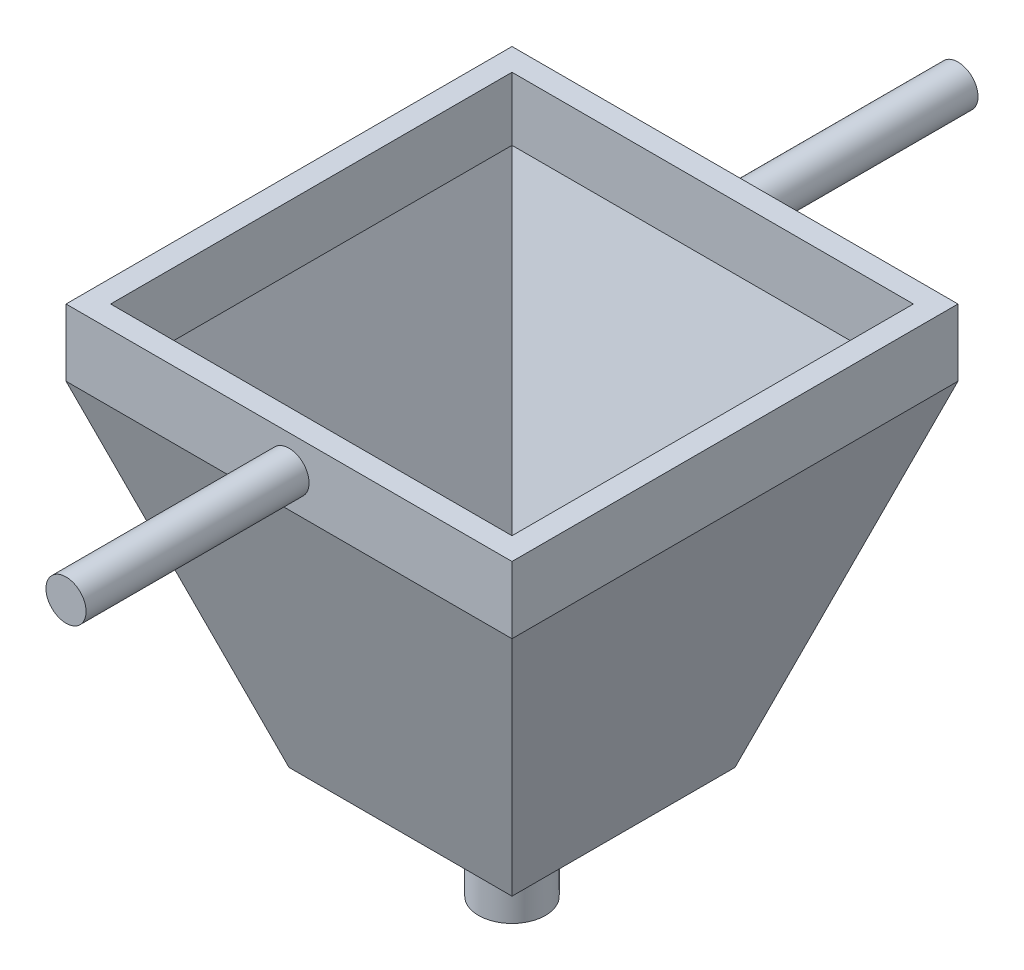
ISO-10303-21;
HEADER;
FILE_DESCRIPTION(('STEP AP214'),'2;1');
FILE_NAME('part.step','',(''),(''),'','','');
FILE_SCHEMA(('AUTOMOTIVE_DESIGN { 1 0 10303 214 1 1 1 1 }'));
ENDSEC;
DATA;
#1=APPLICATION_CONTEXT('core data for automotive mechanical design processes');
#2=APPLICATION_PROTOCOL_DEFINITION('international standard','automotive_design',2000,#1);
#3=PRODUCT_CONTEXT('',#1,'mechanical');
#4=PRODUCT('Part','Part','',(#3));
#5=PRODUCT_RELATED_PRODUCT_CATEGORY('part','',(#4));
#6=PRODUCT_DEFINITION_FORMATION('','',#4);
#7=PRODUCT_DEFINITION_CONTEXT('part definition',#1,'design');
#8=PRODUCT_DEFINITION('design','',#6,#7);
#9=PRODUCT_DEFINITION_SHAPE('','',#8);
#10=(LENGTH_UNIT() NAMED_UNIT(*) SI_UNIT(.MILLI.,.METRE.));
#11=(NAMED_UNIT(*) PLANE_ANGLE_UNIT() SI_UNIT($,.RADIAN.));
#12=(NAMED_UNIT(*) SI_UNIT($,.STERADIAN.) SOLID_ANGLE_UNIT());
#13=UNCERTAINTY_MEASURE_WITH_UNIT(LENGTH_MEASURE(1.E-05),#10,'distance_accuracy_value','');
#14=(GEOMETRIC_REPRESENTATION_CONTEXT(3) GLOBAL_UNCERTAINTY_ASSIGNED_CONTEXT((#13)) GLOBAL_UNIT_ASSIGNED_CONTEXT((#10,
#11,#12)) REPRESENTATION_CONTEXT('',''));
#15=CARTESIAN_POINT('',(0.,0.,0.));
#16=DIRECTION('',(0.,0.,1.));
#17=DIRECTION('',(1.,0.,0.));
#18=AXIS2_PLACEMENT_3D('',#15,#16,#17);
#19=CARTESIAN_POINT('',(0.,16.5,20.));
#20=DIRECTION('',(0.,0.,-1.));
#21=DIRECTION('',(-1.,0.,0.));
#22=AXIS2_PLACEMENT_3D('',#19,#20,#21);
#23=CYLINDRICAL_SURFACE('',#22,0.9);
#24=CARTESIAN_POINT('',(0.,16.5,20.));
#25=DIRECTION('',(0.,0.,1.));
#26=DIRECTION('',(1.,0.,0.));
#27=AXIS2_PLACEMENT_3D('',#24,#25,#26);
#28=CIRCLE('',#27,0.9);
#29=CARTESIAN_POINT('',(0.9,16.5,20.));
#30=VERTEX_POINT('',#29);
#31=EDGE_CURVE('E14',#30,#30,#28,.T.);
#32=ORIENTED_EDGE('',*,*,#31,.F.);
#33=EDGE_LOOP('',(#32));
#34=FACE_BOUND('',#33,.T.);
#35=CARTESIAN_POINT('',(0.,16.5,10.));
#36=DIRECTION('',(0.,0.,1.));
#37=DIRECTION('',(1.,0.,0.));
#38=AXIS2_PLACEMENT_3D('',#35,#36,#37);
#39=CIRCLE('',#38,0.9);
#40=CARTESIAN_POINT('',(0.9,16.5,10.));
#41=VERTEX_POINT('',#40);
#42=EDGE_CURVE('E66',#41,#41,#39,.T.);
#43=ORIENTED_EDGE('',*,*,#42,.T.);
#44=EDGE_LOOP('',(#43));
#45=FACE_BOUND('',#44,.T.);
#46=ADVANCED_FACE('F63',(#34,#45),#23,.T.);
#47=CARTESIAN_POINT('',(0.,16.5,20.));
#48=DIRECTION('',(0.,0.,1.));
#49=DIRECTION('',(1.,0.,0.));
#50=AXIS2_PLACEMENT_3D('',#47,#48,#49);
#51=PLANE('',#50);
#52=ORIENTED_EDGE('',*,*,#31,.T.);
#53=EDGE_LOOP('',(#52));
#54=FACE_BOUND('',#53,.T.);
#55=ADVANCED_FACE('F78',(#54),#51,.T.);
#56=CARTESIAN_POINT('',(0.,16.5,10.));
#57=DIRECTION('',(0.,0.,1.));
#58=DIRECTION('',(1.,0.,0.));
#59=AXIS2_PLACEMENT_3D('',#56,#57,#58);
#60=PLANE('',#59);
#61=ORIENTED_EDGE('',*,*,#42,.F.);
#62=EDGE_LOOP('',(#61));
#63=FACE_BOUND('',#62,.T.);
#64=ADVANCED_FACE('F76',(#63),#60,.F.);
#65=CLOSED_SHELL('',(#46,#55,#64));
#66=MANIFOLD_SOLID_BREP('B2',#65);
#67=CARTESIAN_POINT('',(0.,16.5,-20.));
#68=DIRECTION('',(0.,0.,1.));
#69=DIRECTION('',(1.,0.,0.));
#70=AXIS2_PLACEMENT_3D('',#67,#68,#69);
#71=CYLINDRICAL_SURFACE('',#70,0.900000000000002);
#72=CARTESIAN_POINT('',(0.,16.5,-20.));
#73=DIRECTION('',(0.,0.,-1.));
#74=DIRECTION('',(-1.,0.,0.));
#75=AXIS2_PLACEMENT_3D('',#72,#73,#74);
#76=CIRCLE('',#75,0.900000000000002);
#77=CARTESIAN_POINT('',(-0.900000000000002,16.5,-20.));
#78=VERTEX_POINT('',#77);
#79=EDGE_CURVE('E62',#78,#78,#76,.T.);
#80=ORIENTED_EDGE('',*,*,#79,.F.);
#81=EDGE_LOOP('',(#80));
#82=FACE_BOUND('',#81,.T.);
#83=CARTESIAN_POINT('',(0.,16.5,-10.));
#84=DIRECTION('',(0.,0.,-1.));
#85=DIRECTION('',(-1.,0.,0.));
#86=AXIS2_PLACEMENT_3D('',#83,#84,#85);
#87=CIRCLE('',#86,0.900000000000002);
#88=CARTESIAN_POINT('',(-0.900000000000002,16.5,-10.));
#89=VERTEX_POINT('',#88);
#90=EDGE_CURVE('E118',#89,#89,#87,.T.);
#91=ORIENTED_EDGE('',*,*,#90,.T.);
#92=EDGE_LOOP('',(#91));
#93=FACE_BOUND('',#92,.T.);
#94=ADVANCED_FACE('F115',(#82,#93),#71,.T.);
#95=CARTESIAN_POINT('',(0.,16.5,-20.));
#96=DIRECTION('',(0.,0.,-1.));
#97=DIRECTION('',(-1.,0.,0.));
#98=AXIS2_PLACEMENT_3D('',#95,#96,#97);
#99=PLANE('',#98);
#100=ORIENTED_EDGE('',*,*,#79,.T.);
#101=EDGE_LOOP('',(#100));
#102=FACE_BOUND('',#101,.T.);
#103=ADVANCED_FACE('F130',(#102),#99,.T.);
#104=CARTESIAN_POINT('',(0.,16.5,-10.));
#105=DIRECTION('',(0.,0.,-1.));
#106=DIRECTION('',(-1.,0.,0.));
#107=AXIS2_PLACEMENT_3D('',#104,#105,#106);
#108=PLANE('',#107);
#109=ORIENTED_EDGE('',*,*,#90,.F.);
#110=EDGE_LOOP('',(#109));
#111=FACE_BOUND('',#110,.T.);
#112=ADVANCED_FACE('F128',(#111),#108,.F.);
#113=CLOSED_SHELL('',(#94,#103,#112));
#114=MANIFOLD_SOLID_BREP('B9',#113);
#115=CARTESIAN_POINT('',(0.,-5.,0.));
#116=DIRECTION('',(0.,1.,0.));
#117=DIRECTION('',(0.,0.,1.));
#118=AXIS2_PLACEMENT_3D('',#115,#116,#117);
#119=CYLINDRICAL_SURFACE('',#118,1.5);
#120=CARTESIAN_POINT('',(0.,-5.,0.));
#121=DIRECTION('',(0.,-1.,0.));
#122=DIRECTION('',(0.,0.,-1.));
#123=AXIS2_PLACEMENT_3D('',#120,#121,#122);
#124=CIRCLE('',#123,1.5);
#125=CARTESIAN_POINT('',(0.,-5.,-1.5));
#126=VERTEX_POINT('',#125);
#127=EDGE_CURVE('E113',#126,#126,#124,.T.);
#128=ORIENTED_EDGE('',*,*,#127,.F.);
#129=EDGE_LOOP('',(#128));
#130=FACE_BOUND('',#129,.T.);
#131=CARTESIAN_POINT('',(0.,0.,0.));
#132=DIRECTION('',(0.,-1.,0.));
#133=DIRECTION('',(0.,0.,-1.));
#134=AXIS2_PLACEMENT_3D('',#131,#132,#133);
#135=CIRCLE('',#134,1.5);
#136=CARTESIAN_POINT('',(0.,0.,-1.5));
#137=VERTEX_POINT('',#136);
#138=EDGE_CURVE('E179',#137,#137,#135,.T.);
#139=ORIENTED_EDGE('',*,*,#138,.T.);
#140=EDGE_LOOP('',(#139));
#141=FACE_BOUND('',#140,.T.);
#142=CARTESIAN_POINT('',(1.5,-1.43917780015329,0.));
#143=CARTESIAN_POINT('',(1.50000020822414,-1.43917752533704,0.0502423583340641));
#144=CARTESIAN_POINT('',(1.49745401376693,-1.44298478513104,0.100484543566457));
#145=CARTESIAN_POINT('',(1.48752326211906,-1.45797623220612,0.199366529015834));
#146=CARTESIAN_POINT('',(1.48013640790618,-1.46916392171494,0.248005556977501));
#147=CARTESIAN_POINT('',(1.46125241202354,-1.49823165881571,0.342106153927126));
#148=CARTESIAN_POINT('',(1.44977452746657,-1.51608037015726,0.387581436328778));
#149=CARTESIAN_POINT('',(1.4236306893872,-1.55770948178904,0.474707645498629));
#150=CARTESIAN_POINT('',(1.40896427302755,-1.58149074330357,0.516358015804834));
#151=CARTESIAN_POINT('',(1.37613664684919,-1.636506268837,0.598642350385054));
#152=CARTESIAN_POINT('',(1.3577844878966,-1.66820173052474,0.638890152730338));
#153=CARTESIAN_POINT('',(1.31991156541733,-1.73704282448251,0.713864022346369));
#154=CARTESIAN_POINT('',(1.30038915178416,-1.77419626507216,0.748582027719439));
#155=CARTESIAN_POINT('',(1.25864132339397,-1.85970398395962,0.81711148872748));
#156=CARTESIAN_POINT('',(1.23647533968899,-1.90890062675501,0.849915931813755));
#157=CARTESIAN_POINT('',(1.19542073676408,-2.01335948897656,0.906751785070868));
#158=CARTESIAN_POINT('',(1.17652647977327,-2.06861100093468,0.930798367132495));
#159=CARTESIAN_POINT('',(1.14988133320735,-2.16753344686409,0.963370175057203));
#160=CARTESIAN_POINT('',(1.14048813946218,-2.2099420265902,0.974372236180082));
#161=CARTESIAN_POINT('',(1.12628984829786,-2.29655005252416,0.9907530889261));
#162=CARTESIAN_POINT('',(1.12147684372013,-2.34074627451648,0.996141573259661));
#163=CARTESIAN_POINT('',(1.11718302804083,-2.42991518958136,1.00095682070629));
#164=CARTESIAN_POINT('',(1.11772401279478,-2.47489031187889,1.0003592145882));
#165=CARTESIAN_POINT('',(1.12409887741485,-2.56399528690377,0.993187906666195));
#166=CARTESIAN_POINT('',(1.12993724142592,-2.6081243911696,0.986609141899784));
#167=CARTESIAN_POINT('',(1.14563592995791,-2.69241132577208,0.968324971088712));
#168=CARTESIAN_POINT('',(1.15530744165153,-2.73265846811481,0.956858557405003));
#169=CARTESIAN_POINT('',(1.17754811463845,-2.81068964564904,0.929350592909502));
#170=CARTESIAN_POINT('',(1.19011822916388,-2.84847286530192,0.913307536614355));
#171=CARTESIAN_POINT('',(1.21982098202212,-2.92869049779443,0.873369093698319));
#172=CARTESIAN_POINT('',(1.23736158924507,-2.97050775024735,0.848540261643843));
#173=CARTESIAN_POINT('',(1.27345768922483,-3.04986949764519,0.793344802336529));
#174=CARTESIAN_POINT('',(1.29201441370947,-3.08740862899042,0.762971345040338));
#175=CARTESIAN_POINT('',(1.33271671862096,-3.16544907300885,0.689905826559711));
#176=CARTESIAN_POINT('',(1.35477372355024,-3.20484482450899,0.645969691404499));
#177=CARTESIAN_POINT('',(1.39609050337857,-3.27577604740822,0.55100399955381));
#178=CARTESIAN_POINT('',(1.41535288825285,-3.30731887285433,0.499981149675163));
#179=CARTESIAN_POINT('',(1.44572702044166,-3.35591665946749,0.402428913545601));
#180=CARTESIAN_POINT('',(1.45769630582498,-3.3745994818235,0.356978821685242));
#181=CARTESIAN_POINT('',(1.47753859515521,-3.40523026296523,0.263018021968455));
#182=CARTESIAN_POINT('',(1.48541506063844,-3.4171839137192,0.214509939501018));
#183=CARTESIAN_POINT('',(1.49637941078331,-3.43375838277248,0.115492726585947));
#184=CARTESIAN_POINT('',(1.49944661230576,-3.43834753062247,0.0649759059670237));
#185=CARTESIAN_POINT('',(1.50041557482591,-3.43980134443434,-0.0362207596946167));
#186=CARTESIAN_POINT('',(1.49831769692815,-3.43666655039768,-0.0869005930932817));
#187=CARTESIAN_POINT('',(1.48949794712138,-3.42336577237231,-0.183227858602147));
#188=CARTESIAN_POINT('',(1.48311123195135,-3.41370915127563,-0.228978722339655));
#189=CARTESIAN_POINT('',(1.46659224642396,-3.38837995714691,-0.31805819621364));
#190=CARTESIAN_POINT('',(1.45645937873408,-3.37270642468939,-0.361386418785355));
#191=CARTESIAN_POINT('',(1.4324817626467,-3.33485165163061,-0.447332375233221));
#192=CARTESIAN_POINT('',(1.41844935068245,-3.31233372311153,-0.489748092316564));
#193=CARTESIAN_POINT('',(1.38800927805403,-3.26196115518099,-0.57034151197779));
#194=CARTESIAN_POINT('',(1.37160015200652,-3.23410321989032,-0.608516574097255));
#195=CARTESIAN_POINT('',(1.33477273328243,-3.16887386607092,-0.685927227415323));
#196=CARTESIAN_POINT('',(1.31413078406203,-3.13069467010127,-0.724375937862665));
#197=CARTESIAN_POINT('',(1.27285586536854,-3.04862208518922,-0.794669840332393));
#198=CARTESIAN_POINT('',(1.25222291185946,-3.00472478065389,-0.826510468230433));
#199=CARTESIAN_POINT('',(1.21469839506517,-2.91560659372409,-0.880623882794763));
#200=CARTESIAN_POINT('',(1.19763798588662,-2.87081178325343,-0.903478180804394));
#201=CARTESIAN_POINT('',(1.16719487207113,-2.77724147376272,-0.942481068876251));
#202=CARTESIAN_POINT('',(1.1538055628277,-2.72847333095559,-0.958641728453858));
#203=CARTESIAN_POINT('',(1.13466604076532,-2.63689555658624,-0.981179217293119));
#204=CARTESIAN_POINT('',(1.12797499006895,-2.59459189522382,-0.988792987823092));
#205=CARTESIAN_POINT('',(1.11939733222928,-2.50889115948557,-0.998496029624887));
#206=CARTESIAN_POINT('',(1.11750550674066,-2.46549532458006,-1.00059130142516));
#207=CARTESIAN_POINT('',(1.11882100574833,-2.37885627179493,-0.999119609907757));
#208=CARTESIAN_POINT('',(1.12203134956834,-2.33561315947183,-0.995549293852656));
#209=CARTESIAN_POINT('',(1.1330522619864,-2.25050603588181,-0.982984986109971));
#210=CARTESIAN_POINT('',(1.14086896751217,-2.2086439432229,-0.97398375858765));
#211=CARTESIAN_POINT('',(1.1626342196827,-2.11632220693897,-0.947965178356308));
#212=CARTESIAN_POINT('',(1.17766166854602,-2.06654394378376,-0.929450935941994));
#213=CARTESIAN_POINT('',(1.21111080629161,-1.97143438306388,-0.885422631474874));
#214=CARTESIAN_POINT('',(1.22953724861882,-1.92610945118486,-0.859898741785421));
#215=CARTESIAN_POINT('',(1.26808593269726,-1.83953685655645,-0.801991402694657));
#216=CARTESIAN_POINT('',(1.28823293691071,-1.79837842743403,-0.769491549448272));
#217=CARTESIAN_POINT('',(1.32814150773993,-1.72151656103206,-0.698358840177309));
#218=CARTESIAN_POINT('',(1.3479029541764,-1.68581480164088,-0.659724105134951));
#219=CARTESIAN_POINT('',(1.38815775980392,-1.61582174799623,-0.570728664877768));
#220=CARTESIAN_POINT('',(1.40834902724558,-1.58246848006346,-0.519480834775987));
#221=CARTESIAN_POINT('',(1.44388832937518,-1.5252211618213,-0.410434277887489));
#222=CARTESIAN_POINT('',(1.45924396722731,-1.50131224674147,-0.352646031225022));
#223=CARTESIAN_POINT('',(1.48050822418367,-1.46860051107127,-0.245717534917525));
#224=CARTESIAN_POINT('',(1.48775740184446,-1.45762228060395,-0.197506162628867));
#225=CARTESIAN_POINT('',(1.49750140070948,-1.44291378388427,-0.0995290060120655));
#226=CARTESIAN_POINT('',(1.49999979375663,-1.43917807235529,-0.0497644180940288));
#227=CARTESIAN_POINT('',(1.5,-1.43917780015329,0.));
#228=B_SPLINE_CURVE_WITH_KNOTS('',3,(#142,#143,#144,#145,#146,#147,#148,#149,#150,#151,#152,
#153,#154,#155,#156,#157,#158,#159,#160,#161,#162,#163,#164,#165,#166,#167,#168,#169,#170,#171,
#172,#173,#174,#175,#176,#177,#178,#179,#180,#181,#182,#183,#184,#185,#186,#187,#188,#189,#190,
#191,#192,#193,#194,#195,#196,#197,#198,#199,#200,#201,#202,#203,#204,#205,#206,#207,#208,#209,
#210,#211,#212,#213,#214,#215,#216,#217,#218,#219,#220,#221,#222,#223,#224,#225,#226,#227),
.UNSPECIFIED.,.T.,.F.,(4,2,2,2,2,2,2,2,2,2,2,2,2,2,2,2,2,2,2,2,2,2,2,2,2,2,2,2,2,2,2,2,2,2,2,2,
2,2,2,2,2,2,4),(0.,0.1505266132527,0.301124707174344,0.451023076595116,0.600943219336932,
0.763585145002784,0.926462058021593,1.11503341647991,1.30327652722719,1.43716846838015,
1.57082883922904,1.70503355867689,1.83935198631676,1.96774431099011,2.09617891902539,
2.25073787329797,2.40548851889212,2.5935947724756,2.78152420149865,2.93262043847563,
3.0835886757059,3.23520441646309,3.38680955765891,3.5277654239542,3.66874377568319,
3.81826173413942,3.96787227471786,4.1411408806983,4.31452876587063,4.473249676497,
4.63168313315305,4.76162024003011,4.8914160016149,5.02128860137217,5.15133461921144,
5.31603304346011,5.48096356682587,5.64889622595852,5.81688041978686,6.00897675773024,
6.20076953274023,6.34997645676982,6.49907115623394),.UNSPECIFIED.);
#229=CARTESIAN_POINT('',(1.5,-1.43917780015329,0.));
#230=VERTEX_POINT('',#229);
#231=CARTESIAN_POINT('',(1.5,-3.43917780015329,0.));
#232=VERTEX_POINT('',#231);
#233=EDGE_CURVE('E188',#230,#232,#228,.T.);
#234=ORIENTED_EDGE('',*,*,#233,.F.);
#235=EDGE_CURVE('E186',#232,#230,#228,.T.);
#236=ORIENTED_EDGE('',*,*,#235,.F.);
#237=EDGE_LOOP('',(#234,#236));
#238=FACE_BOUND('',#237,.T.);
#239=ADVANCED_FACE('F170',(#130,#141,#238),#119,.T.);
#240=CARTESIAN_POINT('',(0.,-5.,0.));
#241=DIRECTION('',(0.,-1.,0.));
#242=DIRECTION('',(0.,0.,-1.));
#243=AXIS2_PLACEMENT_3D('',#240,#241,#242);
#244=PLANE('',#243);
#245=CARTESIAN_POINT('',(0.,-5.,0.));
#246=DIRECTION('',(0.,-1.,0.));
#247=DIRECTION('',(0.,0.,-1.));
#248=AXIS2_PLACEMENT_3D('',#245,#246,#247);
#249=CIRCLE('',#248,1.40639171905491);
#250=CARTESIAN_POINT('',(0.,-5.,-1.40639171905491));
#251=VERTEX_POINT('',#250);
#252=EDGE_CURVE('E201',#251,#251,#249,.F.);
#253=ORIENTED_EDGE('',*,*,#252,.T.);
#254=EDGE_LOOP('',(#253));
#255=FACE_BOUND('',#254,.T.);
#256=ORIENTED_EDGE('',*,*,#127,.T.);
#257=EDGE_LOOP('',(#256));
#258=FACE_BOUND('',#257,.T.);
#259=ADVANCED_FACE('F213',(#255,#258),#244,.T.);
#260=CARTESIAN_POINT('',(0.,0.,0.));
#261=DIRECTION('',(0.,-1.,0.));
#262=DIRECTION('',(0.,0.,-1.));
#263=AXIS2_PLACEMENT_3D('',#260,#261,#262);
#264=PLANE('',#263);
#265=CARTESIAN_POINT('',(0.,0.,0.));
#266=DIRECTION('',(0.,-1.,0.));
#267=DIRECTION('',(0.,0.,-1.));
#268=AXIS2_PLACEMENT_3D('',#265,#266,#267);
#269=CIRCLE('',#268,1.40639171905491);
#270=CARTESIAN_POINT('',(0.,0.,-1.40639171905491));
#271=VERTEX_POINT('',#270);
#272=EDGE_CURVE('E174',#271,#271,#269,.F.);
#273=ORIENTED_EDGE('',*,*,#272,.F.);
#274=EDGE_LOOP('',(#273));
#275=FACE_BOUND('',#274,.T.);
#276=ORIENTED_EDGE('',*,*,#138,.F.);
#277=EDGE_LOOP('',(#276));
#278=FACE_BOUND('',#277,.T.);
#279=ADVANCED_FACE('F215',(#275,#278),#264,.F.);
#280=CARTESIAN_POINT('',(1.5,-2.43917780015329,0.));
#281=DIRECTION('',(1.,0.,0.));
#282=DIRECTION('',(0.,0.,-1.));
#283=AXIS2_PLACEMENT_3D('',#280,#281,#282);
#284=PLANE('',#283);
#285=CARTESIAN_POINT('',(1.5,-2.43917780015329,0.));
#286=DIRECTION('',(1.,0.,0.));
#287=DIRECTION('',(0.,0.,-1.));
#288=AXIS2_PLACEMENT_3D('',#285,#286,#287);
#289=CIRCLE('',#288,1.);
#290=EDGE_CURVE('E196',#232,#230,#289,.T.);
#291=ORIENTED_EDGE('',*,*,#290,.T.);
#292=EDGE_CURVE('E198',#230,#232,#289,.T.);
#293=ORIENTED_EDGE('',*,*,#292,.T.);
#294=EDGE_LOOP('',(#291,#293));
#295=FACE_BOUND('',#294,.T.);
#296=ADVANCED_FACE('F200',(#295),#284,.T.);
#297=CARTESIAN_POINT('',(1.5,-2.43917780015329,0.));
#298=DIRECTION('',(-1.,0.,0.));
#299=DIRECTION('',(0.,0.,1.));
#300=AXIS2_PLACEMENT_3D('',#297,#298,#299);
#301=CYLINDRICAL_SURFACE('',#300,1.);
#302=ORIENTED_EDGE('',*,*,#292,.F.);
#303=ORIENTED_EDGE('',*,*,#233,.T.);
#304=EDGE_LOOP('',(#302,#303));
#305=FACE_BOUND('',#304,.T.);
#306=ADVANCED_FACE('F203',(#305),#301,.T.);
#307=ORIENTED_EDGE('',*,*,#290,.F.);
#308=ORIENTED_EDGE('',*,*,#235,.T.);
#309=EDGE_LOOP('',(#307,#308));
#310=FACE_BOUND('',#309,.T.);
#311=ADVANCED_FACE('F195',(#310),#301,.T.);
#312=CARTESIAN_POINT('',(0.,-31.5,0.));
#313=DIRECTION('',(0.,1.,0.));
#314=DIRECTION('',(0.,0.,1.));
#315=AXIS2_PLACEMENT_3D('',#312,#313,#314);
#316=CYLINDRICAL_SURFACE('',#315,1.40639171905491);
#317=ORIENTED_EDGE('',*,*,#252,.F.);
#318=EDGE_LOOP('',(#317));
#319=FACE_BOUND('',#318,.T.);
#320=ORIENTED_EDGE('',*,*,#272,.T.);
#321=EDGE_LOOP('',(#320));
#322=FACE_BOUND('',#321,.T.);
#323=ADVANCED_FACE('F252',(#319,#322),#316,.F.);
#324=CLOSED_SHELL('',(#239,#259,#279,#296,#306,#311,#323));
#325=MANIFOLD_SOLID_BREP('B57',#324);
#326=CARTESIAN_POINT('',(0.,0.,0.));
#327=DIRECTION('',(0.,-1.,0.));
#328=DIRECTION('',(0.,0.,-1.));
#329=AXIS2_PLACEMENT_3D('',#326,#327,#328);
#330=PLANE('',#329);
#331=CARTESIAN_POINT('',(0.,0.,0.));
#332=DIRECTION('',(0.,-1.,0.));
#333=DIRECTION('',(0.,0.,-1.));
#334=AXIS2_PLACEMENT_3D('',#331,#332,#333);
#335=CIRCLE('',#334,1.5);
#336=CARTESIAN_POINT('',(0.,0.,-1.5));
#337=VERTEX_POINT('',#336);
#338=EDGE_CURVE('E754',#337,#337,#335,.T.);
#339=ORIENTED_EDGE('',*,*,#338,.F.);
#340=EDGE_LOOP('',(#339));
#341=FACE_BOUND('',#340,.T.);
#342=DIRECTION('',(0.,0.,-1.));
#343=VECTOR('',#342,1.);
#344=CARTESIAN_POINT('',(5.,0.,5.));
#345=LINE('',#344,#343);
#346=CARTESIAN_POINT('',(5.,0.,5.));
#347=VERTEX_POINT('',#346);
#348=CARTESIAN_POINT('',(5.,0.,-5.));
#349=VERTEX_POINT('',#348);
#350=EDGE_CURVE('E510',#347,#349,#345,.T.);
#351=ORIENTED_EDGE('',*,*,#350,.F.);
#352=DIRECTION('',(1.,0.,0.));
#353=VECTOR('',#352,1.);
#354=CARTESIAN_POINT('',(-5.,0.,5.));
#355=LINE('',#354,#353);
#356=CARTESIAN_POINT('',(-5.,0.,5.));
#357=VERTEX_POINT('',#356);
#358=EDGE_CURVE('E168',#357,#347,#355,.T.);
#359=ORIENTED_EDGE('',*,*,#358,.F.);
#360=DIRECTION('',(0.,0.,1.));
#361=VECTOR('',#360,1.);
#362=CARTESIAN_POINT('',(-5.,0.,5.));
#363=LINE('',#362,#361);
#364=CARTESIAN_POINT('',(-5.,0.,-5.));
#365=VERTEX_POINT('',#364);
#366=EDGE_CURVE('E290',#365,#357,#363,.T.);
#367=ORIENTED_EDGE('',*,*,#366,.F.);
#368=DIRECTION('',(-1.,0.,0.));
#369=VECTOR('',#368,1.);
#370=CARTESIAN_POINT('',(-5.,0.,-5.));
#371=LINE('',#370,#369);
#372=EDGE_CURVE('E498',#349,#365,#371,.T.);
#373=ORIENTED_EDGE('',*,*,#372,.F.);
#374=EDGE_LOOP('',(#351,#359,#367,#373));
#375=FACE_BOUND('',#374,.T.);
#376=ADVANCED_FACE('F281',(#341,#375),#330,.T.);
#377=CARTESIAN_POINT('',(-4.5,-1.5,0.));
#378=DIRECTION('',(-0.948683298050514,-0.316227766016838,0.));
#379=DIRECTION('',(0.316227766016838,-0.948683298050514,0.));
#380=AXIS2_PLACEMENT_3D('',#377,#378,#379);
#381=PLANE('',#380);
#382=DIRECTION('',(0.301511344577764,-0.904534033733291,0.301511344577763));
#383=VECTOR('',#382,1.);
#384=CARTESIAN_POINT('',(-10.,15.,-10.));
#385=LINE('',#384,#383);
#386=CARTESIAN_POINT('',(-10.,15.,-10.));
#387=VERTEX_POINT('',#386);
#388=EDGE_CURVE('E554',#387,#365,#385,.T.);
#389=ORIENTED_EDGE('',*,*,#388,.T.);
#390=ORIENTED_EDGE('',*,*,#366,.T.);
#391=DIRECTION('',(0.301511344577764,-0.904534033733291,-0.301511344577764));
#392=VECTOR('',#391,1.);
#393=CARTESIAN_POINT('',(-10.,15.,10.));
#394=LINE('',#393,#392);
#395=CARTESIAN_POINT('',(-10.,15.,10.));
#396=VERTEX_POINT('',#395);
#397=EDGE_CURVE('E452',#396,#357,#394,.T.);
#398=ORIENTED_EDGE('',*,*,#397,.F.);
#399=DIRECTION('',(0.,0.,1.));
#400=VECTOR('',#399,1.);
#401=CARTESIAN_POINT('',(-10.,15.,10.));
#402=LINE('',#401,#400);
#403=EDGE_CURVE('E566',#387,#396,#402,.T.);
#404=ORIENTED_EDGE('',*,*,#403,.F.);
#405=EDGE_LOOP('',(#389,#390,#398,#404));
#406=FACE_BOUND('',#405,.T.);
#407=ADVANCED_FACE('F465',(#406),#381,.T.);
#408=CARTESIAN_POINT('',(0.,-1.5,4.5));
#409=DIRECTION('',(0.,-0.316227766016838,0.948683298050514));
#410=DIRECTION('',(0.,-0.948683298050514,-0.316227766016838));
#411=AXIS2_PLACEMENT_3D('',#408,#409,#410);
#412=PLANE('',#411);
#413=ORIENTED_EDGE('',*,*,#397,.T.);
#414=ORIENTED_EDGE('',*,*,#358,.T.);
#415=DIRECTION('',(-0.301511344577763,-0.904534033733291,-0.301511344577764));
#416=VECTOR('',#415,1.);
#417=CARTESIAN_POINT('',(10.,15.,10.));
#418=LINE('',#417,#416);
#419=CARTESIAN_POINT('',(10.,15.,10.));
#420=VERTEX_POINT('',#419);
#421=EDGE_CURVE('E306',#420,#347,#418,.T.);
#422=ORIENTED_EDGE('',*,*,#421,.F.);
#423=DIRECTION('',(1.,0.,0.));
#424=VECTOR('',#423,1.);
#425=CARTESIAN_POINT('',(-10.,15.,10.));
#426=LINE('',#425,#424);
#427=EDGE_CURVE('E446',#396,#420,#426,.T.);
#428=ORIENTED_EDGE('',*,*,#427,.F.);
#429=EDGE_LOOP('',(#413,#414,#422,#428));
#430=FACE_BOUND('',#429,.T.);
#431=ADVANCED_FACE('F454',(#430),#412,.T.);
#432=CARTESIAN_POINT('',(0.,-1.5,-4.5));
#433=DIRECTION('',(0.,-0.316227766016838,-0.948683298050514));
#434=DIRECTION('',(0.,0.948683298050514,-0.316227766016838));
#435=AXIS2_PLACEMENT_3D('',#432,#433,#434);
#436=PLANE('',#435);
#437=DIRECTION('',(-0.301511344577763,-0.904534033733291,0.301511344577764));
#438=VECTOR('',#437,1.);
#439=CARTESIAN_POINT('',(10.,15.,-10.));
#440=LINE('',#439,#438);
#441=CARTESIAN_POINT('',(10.,15.,-10.));
#442=VERTEX_POINT('',#441);
#443=EDGE_CURVE('E539',#442,#349,#440,.T.);
#444=ORIENTED_EDGE('',*,*,#443,.T.);
#445=ORIENTED_EDGE('',*,*,#372,.T.);
#446=ORIENTED_EDGE('',*,*,#388,.F.);
#447=DIRECTION('',(-1.,0.,0.));
#448=VECTOR('',#447,1.);
#449=CARTESIAN_POINT('',(-10.,15.,-10.));
#450=LINE('',#449,#448);
#451=EDGE_CURVE('E551',#442,#387,#450,.T.);
#452=ORIENTED_EDGE('',*,*,#451,.F.);
#453=EDGE_LOOP('',(#444,#445,#446,#452));
#454=FACE_BOUND('',#453,.T.);
#455=ADVANCED_FACE('F464',(#454),#436,.T.);
#456=CARTESIAN_POINT('',(4.5,-1.5,0.));
#457=DIRECTION('',(0.948683298050514,-0.316227766016838,0.));
#458=DIRECTION('',(0.316227766016838,0.948683298050514,0.));
#459=AXIS2_PLACEMENT_3D('',#456,#457,#458);
#460=PLANE('',#459);
#461=ORIENTED_EDGE('',*,*,#421,.T.);
#462=ORIENTED_EDGE('',*,*,#350,.T.);
#463=ORIENTED_EDGE('',*,*,#443,.F.);
#464=DIRECTION('',(0.,0.,-1.));
#465=VECTOR('',#464,1.);
#466=CARTESIAN_POINT('',(10.,15.,10.));
#467=LINE('',#466,#465);
#468=EDGE_CURVE('E536',#420,#442,#467,.T.);
#469=ORIENTED_EDGE('',*,*,#468,.F.);
#470=EDGE_LOOP('',(#461,#462,#463,#469));
#471=FACE_BOUND('',#470,.T.);
#472=ADVANCED_FACE('F516',(#471),#460,.T.);
#473=CARTESIAN_POINT('',(-10.,18.,10.));
#474=DIRECTION('',(1.,0.,0.));
#475=DIRECTION('',(0.,0.,-1.));
#476=AXIS2_PLACEMENT_3D('',#473,#474,#475);
#477=PLANE('',#476);
#478=ORIENTED_EDGE('',*,*,#403,.T.);
#479=DIRECTION('',(0.,-1.,0.));
#480=VECTOR('',#479,1.);
#481=CARTESIAN_POINT('',(-10.,18.,10.));
#482=LINE('',#481,#480);
#483=CARTESIAN_POINT('',(-10.,18.,10.));
#484=VERTEX_POINT('',#483);
#485=EDGE_CURVE('E616',#484,#396,#482,.T.);
#486=ORIENTED_EDGE('',*,*,#485,.F.);
#487=DIRECTION('',(0.,0.,1.));
#488=VECTOR('',#487,1.);
#489=CARTESIAN_POINT('',(-10.,18.,10.));
#490=LINE('',#489,#488);
#491=CARTESIAN_POINT('',(-10.,18.,-10.));
#492=VERTEX_POINT('',#491);
#493=EDGE_CURVE('E382',#492,#484,#490,.T.);
#494=ORIENTED_EDGE('',*,*,#493,.F.);
#495=DIRECTION('',(0.,-1.,0.));
#496=VECTOR('',#495,1.);
#497=CARTESIAN_POINT('',(-10.,18.,-10.));
#498=LINE('',#497,#496);
#499=EDGE_CURVE('E440',#492,#387,#498,.T.);
#500=ORIENTED_EDGE('',*,*,#499,.T.);
#501=EDGE_LOOP('',(#478,#486,#494,#500));
#502=FACE_BOUND('',#501,.T.);
#503=ADVANCED_FACE('F524',(#502),#477,.F.);
#504=CARTESIAN_POINT('',(10.,18.,10.));
#505=DIRECTION('',(0.,0.,-1.));
#506=DIRECTION('',(-1.,0.,0.));
#507=AXIS2_PLACEMENT_3D('',#504,#505,#506);
#508=PLANE('',#507);
#509=CARTESIAN_POINT('',(0.,16.5,10.));
#510=DIRECTION('',(0.,0.,1.));
#511=DIRECTION('',(1.,0.,0.));
#512=AXIS2_PLACEMENT_3D('',#509,#510,#511);
#513=CIRCLE('',#512,0.9);
#514=CARTESIAN_POINT('',(0.9,16.5,10.));
#515=VERTEX_POINT('',#514);
#516=EDGE_CURVE('E939',#515,#515,#513,.T.);
#517=ORIENTED_EDGE('',*,*,#516,.F.);
#518=EDGE_LOOP('',(#517));
#519=FACE_BOUND('',#518,.T.);
#520=ORIENTED_EDGE('',*,*,#427,.T.);
#521=DIRECTION('',(0.,-1.,0.));
#522=VECTOR('',#521,1.);
#523=CARTESIAN_POINT('',(10.,18.,10.));
#524=LINE('',#523,#522);
#525=CARTESIAN_POINT('',(10.,18.,10.));
#526=VERTEX_POINT('',#525);
#527=EDGE_CURVE('E608',#526,#420,#524,.T.);
#528=ORIENTED_EDGE('',*,*,#527,.F.);
#529=DIRECTION('',(1.,0.,0.));
#530=VECTOR('',#529,1.);
#531=CARTESIAN_POINT('',(10.,18.,10.));
#532=LINE('',#531,#530);
#533=EDGE_CURVE('E434',#484,#526,#532,.T.);
#534=ORIENTED_EDGE('',*,*,#533,.F.);
#535=ORIENTED_EDGE('',*,*,#485,.T.);
#536=EDGE_LOOP('',(#520,#528,#534,#535));
#537=FACE_BOUND('',#536,.T.);
#538=ADVANCED_FACE('F628',(#519,#537),#508,.F.);
#539=CARTESIAN_POINT('',(10.,18.,10.));
#540=DIRECTION('',(-1.,0.,0.));
#541=DIRECTION('',(0.,0.,1.));
#542=AXIS2_PLACEMENT_3D('',#539,#540,#541);
#543=PLANE('',#542);
#544=ORIENTED_EDGE('',*,*,#468,.T.);
#545=DIRECTION('',(0.,-1.,0.));
#546=VECTOR('',#545,1.);
#547=CARTESIAN_POINT('',(10.,18.,-10.));
#548=LINE('',#547,#546);
#549=CARTESIAN_POINT('',(10.,18.,-10.));
#550=VERTEX_POINT('',#549);
#551=EDGE_CURVE('E617',#550,#442,#548,.T.);
#552=ORIENTED_EDGE('',*,*,#551,.F.);
#553=DIRECTION('',(0.,0.,-1.));
#554=VECTOR('',#553,1.);
#555=CARTESIAN_POINT('',(10.,18.,10.));
#556=LINE('',#555,#554);
#557=EDGE_CURVE('E436',#526,#550,#556,.T.);
#558=ORIENTED_EDGE('',*,*,#557,.F.);
#559=ORIENTED_EDGE('',*,*,#527,.T.);
#560=EDGE_LOOP('',(#544,#552,#558,#559));
#561=FACE_BOUND('',#560,.T.);
#562=ADVANCED_FACE('F637',(#561),#543,.F.);
#563=CARTESIAN_POINT('',(10.,18.,-10.));
#564=DIRECTION('',(0.,0.,1.));
#565=DIRECTION('',(1.,0.,0.));
#566=AXIS2_PLACEMENT_3D('',#563,#564,#565);
#567=PLANE('',#566);
#568=CARTESIAN_POINT('',(0.,16.5,-10.));
#569=DIRECTION('',(0.,0.,-1.));
#570=DIRECTION('',(-1.,0.,0.));
#571=AXIS2_PLACEMENT_3D('',#568,#569,#570);
#572=CIRCLE('',#571,0.9);
#573=CARTESIAN_POINT('',(-0.9,16.5,-10.));
#574=VERTEX_POINT('',#573);
#575=EDGE_CURVE('E759',#574,#574,#572,.T.);
#576=ORIENTED_EDGE('',*,*,#575,.F.);
#577=EDGE_LOOP('',(#576));
#578=FACE_BOUND('',#577,.T.);
#579=ORIENTED_EDGE('',*,*,#451,.T.);
#580=ORIENTED_EDGE('',*,*,#499,.F.);
#581=DIRECTION('',(-1.,0.,0.));
#582=VECTOR('',#581,1.);
#583=CARTESIAN_POINT('',(10.,18.,-10.));
#584=LINE('',#583,#582);
#585=EDGE_CURVE('E438',#550,#492,#584,.T.);
#586=ORIENTED_EDGE('',*,*,#585,.F.);
#587=ORIENTED_EDGE('',*,*,#551,.T.);
#588=EDGE_LOOP('',(#579,#580,#586,#587));
#589=FACE_BOUND('',#588,.T.);
#590=ADVANCED_FACE('F681',(#578,#589),#567,.F.);
#591=CARTESIAN_POINT('',(0.,18.,0.));
#592=DIRECTION('',(0.,1.,0.));
#593=DIRECTION('',(0.,0.,1.));
#594=AXIS2_PLACEMENT_3D('',#591,#592,#593);
#595=PLANE('',#594);
#596=DIRECTION('',(0.,0.,1.));
#597=VECTOR('',#596,1.);
#598=CARTESIAN_POINT('',(-9.,18.,10.));
#599=LINE('',#598,#597);
#600=CARTESIAN_POINT('',(-9.,18.,-9.));
#601=VERTEX_POINT('',#600);
#602=CARTESIAN_POINT('',(-9.,18.,9.));
#603=VERTEX_POINT('',#602);
#604=EDGE_CURVE('E425',#601,#603,#599,.T.);
#605=ORIENTED_EDGE('',*,*,#604,.F.);
#606=DIRECTION('',(-1.,0.,0.));
#607=VECTOR('',#606,1.);
#608=CARTESIAN_POINT('',(10.,18.,-9.));
#609=LINE('',#608,#607);
#610=CARTESIAN_POINT('',(9.,18.,-9.));
#611=VERTEX_POINT('',#610);
#612=EDGE_CURVE('E421',#611,#601,#609,.T.);
#613=ORIENTED_EDGE('',*,*,#612,.F.);
#614=DIRECTION('',(0.,0.,-1.));
#615=VECTOR('',#614,1.);
#616=CARTESIAN_POINT('',(9.,18.,10.));
#617=LINE('',#616,#615);
#618=CARTESIAN_POINT('',(9.,18.,9.));
#619=VERTEX_POINT('',#618);
#620=EDGE_CURVE('E429',#619,#611,#617,.T.);
#621=ORIENTED_EDGE('',*,*,#620,.F.);
#622=DIRECTION('',(1.,0.,0.));
#623=VECTOR('',#622,1.);
#624=CARTESIAN_POINT('',(10.,18.,9.));
#625=LINE('',#624,#623);
#626=EDGE_CURVE('E427',#603,#619,#625,.T.);
#627=ORIENTED_EDGE('',*,*,#626,.F.);
#628=EDGE_LOOP('',(#605,#613,#621,#627));
#629=FACE_BOUND('',#628,.T.);
#630=ORIENTED_EDGE('',*,*,#493,.T.);
#631=ORIENTED_EDGE('',*,*,#533,.T.);
#632=ORIENTED_EDGE('',*,*,#557,.T.);
#633=ORIENTED_EDGE('',*,*,#585,.T.);
#634=EDGE_LOOP('',(#630,#631,#632,#633));
#635=FACE_BOUND('',#634,.T.);
#636=ADVANCED_FACE('F690',(#629,#635),#595,.T.);
#637=CARTESIAN_POINT('',(0.,1.,0.));
#638=DIRECTION('',(0.,-1.,0.));
#639=DIRECTION('',(0.,0.,-1.));
#640=AXIS2_PLACEMENT_3D('',#637,#638,#639);
#641=PLANE('',#640);
#642=CARTESIAN_POINT('',(0.,1.,0.));
#643=DIRECTION('',(0.,-1.,0.));
#644=DIRECTION('',(0.,0.,-1.));
#645=AXIS2_PLACEMENT_3D('',#642,#643,#644);
#646=CIRCLE('',#645,1.5);
#647=CARTESIAN_POINT('',(0.,1.,-1.5));
#648=VERTEX_POINT('',#647);
#649=EDGE_CURVE('E285',#648,#648,#646,.T.);
#650=ORIENTED_EDGE('',*,*,#649,.T.);
#651=EDGE_LOOP('',(#650));
#652=FACE_BOUND('',#651,.T.);
#653=DIRECTION('',(0.,0.,-1.));
#654=VECTOR('',#653,1.);
#655=CARTESIAN_POINT('',(4.27924077994388,1.,0.));
#656=LINE('',#655,#654);
#657=CARTESIAN_POINT('',(4.27924077994388,1.,4.27924077994387));
#658=VERTEX_POINT('',#657);
#659=CARTESIAN_POINT('',(4.27924077994388,1.,-4.27924077994387));
#660=VERTEX_POINT('',#659);
#661=EDGE_CURVE('E407',#658,#660,#656,.T.);
#662=ORIENTED_EDGE('',*,*,#661,.T.);
#663=DIRECTION('',(-1.,0.,0.));
#664=VECTOR('',#663,1.);
#665=CARTESIAN_POINT('',(0.,1.,-4.27924077994387));
#666=LINE('',#665,#664);
#667=CARTESIAN_POINT('',(-4.27924077994387,1.,-4.27924077994387));
#668=VERTEX_POINT('',#667);
#669=EDGE_CURVE('E387',#660,#668,#666,.T.);
#670=ORIENTED_EDGE('',*,*,#669,.T.);
#671=DIRECTION('',(0.,0.,1.));
#672=VECTOR('',#671,1.);
#673=CARTESIAN_POINT('',(-4.27924077994387,1.,0.));
#674=LINE('',#673,#672);
#675=CARTESIAN_POINT('',(-4.27924077994387,1.,4.27924077994387));
#676=VERTEX_POINT('',#675);
#677=EDGE_CURVE('E383',#668,#676,#674,.T.);
#678=ORIENTED_EDGE('',*,*,#677,.T.);
#679=DIRECTION('',(1.,0.,0.));
#680=VECTOR('',#679,1.);
#681=CARTESIAN_POINT('',(0.,1.,4.27924077994387));
#682=LINE('',#681,#680);
#683=EDGE_CURVE('E371',#676,#658,#682,.T.);
#684=ORIENTED_EDGE('',*,*,#683,.T.);
#685=EDGE_LOOP('',(#662,#670,#678,#684));
#686=FACE_BOUND('',#685,.T.);
#687=ADVANCED_FACE('F386',(#652,#686),#641,.F.);
#688=CARTESIAN_POINT('',(-3.55131670194948,-1.18377223398316,0.));
#689=DIRECTION('',(-0.948683298050514,-0.316227766016838,0.));
#690=DIRECTION('',(0.316227766016838,-0.948683298050514,0.));
#691=AXIS2_PLACEMENT_3D('',#688,#689,#690);
#692=PLANE('',#691);
#693=DIRECTION('',(0.301511344577764,-0.904534033733291,0.301511344577763));
#694=VECTOR('',#693,1.);
#695=CARTESIAN_POINT('',(-3.22846972904498,-2.15231315269666,-3.22846972904499));
#696=LINE('',#695,#694);
#697=CARTESIAN_POINT('',(-9.,15.1622776601684,-9.));
#698=VERTEX_POINT('',#697);
#699=EDGE_CURVE('E396',#698,#668,#696,.T.);
#700=ORIENTED_EDGE('',*,*,#699,.F.);
#701=DIRECTION('',(0.,0.,1.));
#702=VECTOR('',#701,1.);
#703=CARTESIAN_POINT('',(-9.,15.1622776601684,0.));
#704=LINE('',#703,#702);
#705=CARTESIAN_POINT('',(-9.,15.1622776601684,9.));
#706=VERTEX_POINT('',#705);
#707=EDGE_CURVE('E394',#698,#706,#704,.T.);
#708=ORIENTED_EDGE('',*,*,#707,.T.);
#709=DIRECTION('',(0.301511344577764,-0.904534033733291,-0.301511344577764));
#710=VECTOR('',#709,1.);
#711=CARTESIAN_POINT('',(-3.22846972904498,-2.15231315269666,3.22846972904498));
#712=LINE('',#711,#710);
#713=EDGE_CURVE('E376',#706,#676,#712,.T.);
#714=ORIENTED_EDGE('',*,*,#713,.T.);
#715=ORIENTED_EDGE('',*,*,#677,.F.);
#716=EDGE_LOOP('',(#700,#708,#714,#715));
#717=FACE_BOUND('',#716,.T.);
#718=ADVANCED_FACE('F393',(#717),#692,.F.);
#719=CARTESIAN_POINT('',(0.,-1.18377223398316,3.55131670194948));
#720=DIRECTION('',(0.,-0.316227766016838,0.948683298050514));
#721=DIRECTION('',(0.,-0.948683298050514,-0.316227766016838));
#722=AXIS2_PLACEMENT_3D('',#719,#720,#721);
#723=PLANE('',#722);
#724=ORIENTED_EDGE('',*,*,#713,.F.);
#725=DIRECTION('',(1.,0.,0.));
#726=VECTOR('',#725,1.);
#727=CARTESIAN_POINT('',(0.,15.1622776601684,9.));
#728=LINE('',#727,#726);
#729=CARTESIAN_POINT('',(9.,15.1622776601684,9.));
#730=VERTEX_POINT('',#729);
#731=EDGE_CURVE('E400',#706,#730,#728,.T.);
#732=ORIENTED_EDGE('',*,*,#731,.T.);
#733=DIRECTION('',(-0.301511344577763,-0.904534033733291,-0.301511344577764));
#734=VECTOR('',#733,1.);
#735=CARTESIAN_POINT('',(3.22846972904499,-2.15231315269666,3.22846972904498));
#736=LINE('',#735,#734);
#737=EDGE_CURVE('E378',#730,#658,#736,.T.);
#738=ORIENTED_EDGE('',*,*,#737,.T.);
#739=ORIENTED_EDGE('',*,*,#683,.F.);
#740=EDGE_LOOP('',(#724,#732,#738,#739));
#741=FACE_BOUND('',#740,.T.);
#742=ADVANCED_FACE('F373',(#741),#723,.F.);
#743=CARTESIAN_POINT('',(0.,-1.18377223398316,-3.55131670194949));
#744=DIRECTION('',(0.,-0.316227766016838,-0.948683298050514));
#745=DIRECTION('',(0.,0.948683298050514,-0.316227766016838));
#746=AXIS2_PLACEMENT_3D('',#743,#744,#745);
#747=PLANE('',#746);
#748=DIRECTION('',(-0.301511344577763,-0.904534033733291,0.301511344577764));
#749=VECTOR('',#748,1.);
#750=CARTESIAN_POINT('',(3.22846972904499,-2.15231315269666,-3.22846972904499));
#751=LINE('',#750,#749);
#752=CARTESIAN_POINT('',(9.,15.1622776601684,-9.));
#753=VERTEX_POINT('',#752);
#754=EDGE_CURVE('E395',#753,#660,#751,.T.);
#755=ORIENTED_EDGE('',*,*,#754,.F.);
#756=DIRECTION('',(-1.,0.,0.));
#757=VECTOR('',#756,1.);
#758=CARTESIAN_POINT('',(0.,15.1622776601684,-9.));
#759=LINE('',#758,#757);
#760=EDGE_CURVE('E405',#753,#698,#759,.T.);
#761=ORIENTED_EDGE('',*,*,#760,.T.);
#762=ORIENTED_EDGE('',*,*,#699,.T.);
#763=ORIENTED_EDGE('',*,*,#669,.F.);
#764=EDGE_LOOP('',(#755,#761,#762,#763));
#765=FACE_BOUND('',#764,.T.);
#766=ADVANCED_FACE('F714',(#765),#747,.F.);
#767=CARTESIAN_POINT('',(3.55131670194949,-1.18377223398316,0.));
#768=DIRECTION('',(0.948683298050514,-0.316227766016838,0.));
#769=DIRECTION('',(0.316227766016838,0.948683298050514,0.));
#770=AXIS2_PLACEMENT_3D('',#767,#768,#769);
#771=PLANE('',#770);
#772=ORIENTED_EDGE('',*,*,#737,.F.);
#773=DIRECTION('',(0.,0.,-1.));
#774=VECTOR('',#773,1.);
#775=CARTESIAN_POINT('',(9.,15.1622776601684,0.));
#776=LINE('',#775,#774);
#777=EDGE_CURVE('E409',#730,#753,#776,.T.);
#778=ORIENTED_EDGE('',*,*,#777,.T.);
#779=ORIENTED_EDGE('',*,*,#754,.T.);
#780=ORIENTED_EDGE('',*,*,#661,.F.);
#781=EDGE_LOOP('',(#772,#778,#779,#780));
#782=FACE_BOUND('',#781,.T.);
#783=ADVANCED_FACE('F710',(#782),#771,.F.);
#784=CARTESIAN_POINT('',(-9.,18.,10.));
#785=DIRECTION('',(1.,0.,0.));
#786=DIRECTION('',(0.,0.,-1.));
#787=AXIS2_PLACEMENT_3D('',#784,#785,#786);
#788=PLANE('',#787);
#789=ORIENTED_EDGE('',*,*,#707,.F.);
#790=DIRECTION('',(0.,-1.,0.));
#791=VECTOR('',#790,1.);
#792=CARTESIAN_POINT('',(-9.,18.,-9.));
#793=LINE('',#792,#791);
#794=EDGE_CURVE('E418',#601,#698,#793,.T.);
#795=ORIENTED_EDGE('',*,*,#794,.F.);
#796=ORIENTED_EDGE('',*,*,#604,.T.);
#797=DIRECTION('',(0.,-1.,0.));
#798=VECTOR('',#797,1.);
#799=CARTESIAN_POINT('',(-9.,18.,9.));
#800=LINE('',#799,#798);
#801=EDGE_CURVE('E412',#603,#706,#800,.T.);
#802=ORIENTED_EDGE('',*,*,#801,.T.);
#803=EDGE_LOOP('',(#789,#795,#796,#802));
#804=FACE_BOUND('',#803,.T.);
#805=ADVANCED_FACE('F706',(#804),#788,.T.);
#806=CARTESIAN_POINT('',(10.,18.,9.));
#807=DIRECTION('',(0.,0.,-1.));
#808=DIRECTION('',(-1.,0.,0.));
#809=AXIS2_PLACEMENT_3D('',#806,#807,#808);
#810=PLANE('',#809);
#811=ORIENTED_EDGE('',*,*,#731,.F.);
#812=ORIENTED_EDGE('',*,*,#801,.F.);
#813=ORIENTED_EDGE('',*,*,#626,.T.);
#814=DIRECTION('',(0.,-1.,0.));
#815=VECTOR('',#814,1.);
#816=CARTESIAN_POINT('',(9.,18.,9.));
#817=LINE('',#816,#815);
#818=EDGE_CURVE('E417',#619,#730,#817,.T.);
#819=ORIENTED_EDGE('',*,*,#818,.T.);
#820=EDGE_LOOP('',(#811,#812,#813,#819));
#821=FACE_BOUND('',#820,.T.);
#822=ADVANCED_FACE('F702',(#821),#810,.T.);
#823=CARTESIAN_POINT('',(9.,18.,10.));
#824=DIRECTION('',(-1.,0.,0.));
#825=DIRECTION('',(0.,0.,1.));
#826=AXIS2_PLACEMENT_3D('',#823,#824,#825);
#827=PLANE('',#826);
#828=ORIENTED_EDGE('',*,*,#777,.F.);
#829=ORIENTED_EDGE('',*,*,#818,.F.);
#830=ORIENTED_EDGE('',*,*,#620,.T.);
#831=DIRECTION('',(0.,-1.,0.));
#832=VECTOR('',#831,1.);
#833=CARTESIAN_POINT('',(9.,18.,-9.));
#834=LINE('',#833,#832);
#835=EDGE_CURVE('E298',#611,#753,#834,.T.);
#836=ORIENTED_EDGE('',*,*,#835,.T.);
#837=EDGE_LOOP('',(#828,#829,#830,#836));
#838=FACE_BOUND('',#837,.T.);
#839=ADVANCED_FACE('F699',(#838),#827,.T.);
#840=CARTESIAN_POINT('',(10.,18.,-9.));
#841=DIRECTION('',(0.,0.,1.));
#842=DIRECTION('',(1.,0.,0.));
#843=AXIS2_PLACEMENT_3D('',#840,#841,#842);
#844=PLANE('',#843);
#845=ORIENTED_EDGE('',*,*,#760,.F.);
#846=ORIENTED_EDGE('',*,*,#835,.F.);
#847=ORIENTED_EDGE('',*,*,#612,.T.);
#848=ORIENTED_EDGE('',*,*,#794,.T.);
#849=EDGE_LOOP('',(#845,#846,#847,#848));
#850=FACE_BOUND('',#849,.T.);
#851=ADVANCED_FACE('F695',(#850),#844,.T.);
#852=CARTESIAN_POINT('',(0.,3.,0.));
#853=DIRECTION('',(0.,-1.,0.));
#854=DIRECTION('',(0.,0.,-1.));
#855=AXIS2_PLACEMENT_3D('',#852,#853,#854);
#856=CYLINDRICAL_SURFACE('',#855,1.5);
#857=ORIENTED_EDGE('',*,*,#338,.T.);
#858=EDGE_LOOP('',(#857));
#859=FACE_BOUND('',#858,.T.);
#860=ORIENTED_EDGE('',*,*,#649,.F.);
#861=EDGE_LOOP('',(#860));
#862=FACE_BOUND('',#861,.T.);
#863=ADVANCED_FACE('F698',(#859,#862),#856,.F.);
#864=CARTESIAN_POINT('',(0.,16.5,-9.8));
#865=DIRECTION('',(0.,0.,-1.));
#866=DIRECTION('',(-1.,0.,0.));
#867=AXIS2_PLACEMENT_3D('',#864,#865,#866);
#868=CYLINDRICAL_SURFACE('',#867,0.9);
#869=CARTESIAN_POINT('',(0.,16.5,-9.8));
#870=DIRECTION('',(0.,0.,-1.));
#871=DIRECTION('',(-1.,0.,0.));
#872=AXIS2_PLACEMENT_3D('',#869,#870,#871);
#873=CIRCLE('',#872,0.9);
#874=CARTESIAN_POINT('',(-0.9,16.5,-9.8));
#875=VERTEX_POINT('',#874);
#876=EDGE_CURVE('E755',#875,#875,#873,.T.);
#877=ORIENTED_EDGE('',*,*,#876,.F.);
#878=EDGE_LOOP('',(#877));
#879=FACE_BOUND('',#878,.T.);
#880=ORIENTED_EDGE('',*,*,#575,.T.);
#881=EDGE_LOOP('',(#880));
#882=FACE_BOUND('',#881,.T.);
#883=ADVANCED_FACE('F728',(#879,#882),#868,.F.);
#884=CARTESIAN_POINT('',(0.,16.5,-9.8));
#885=DIRECTION('',(0.,0.,-1.));
#886=DIRECTION('',(-1.,0.,0.));
#887=AXIS2_PLACEMENT_3D('',#884,#885,#886);
#888=PLANE('',#887);
#889=ORIENTED_EDGE('',*,*,#876,.T.);
#890=EDGE_LOOP('',(#889));
#891=FACE_BOUND('',#890,.T.);
#892=ADVANCED_FACE('F732',(#891),#888,.T.);
#893=CARTESIAN_POINT('',(0.,16.5,9.8));
#894=DIRECTION('',(0.,0.,1.));
#895=DIRECTION('',(1.,0.,0.));
#896=AXIS2_PLACEMENT_3D('',#893,#894,#895);
#897=CYLINDRICAL_SURFACE('',#896,0.9);
#898=CARTESIAN_POINT('',(0.,16.5,9.8));
#899=DIRECTION('',(0.,0.,1.));
#900=DIRECTION('',(1.,0.,0.));
#901=AXIS2_PLACEMENT_3D('',#898,#899,#900);
#902=CIRCLE('',#901,0.9);
#903=CARTESIAN_POINT('',(0.9,16.5,9.8));
#904=VERTEX_POINT('',#903);
#905=EDGE_CURVE('E937',#904,#904,#902,.T.);
#906=ORIENTED_EDGE('',*,*,#905,.F.);
#907=EDGE_LOOP('',(#906));
#908=FACE_BOUND('',#907,.T.);
#909=ORIENTED_EDGE('',*,*,#516,.T.);
#910=EDGE_LOOP('',(#909));
#911=FACE_BOUND('',#910,.T.);
#912=ADVANCED_FACE('F736',(#908,#911),#897,.F.);
#913=CARTESIAN_POINT('',(0.,16.5,9.8));
#914=DIRECTION('',(0.,0.,1.));
#915=DIRECTION('',(1.,0.,0.));
#916=AXIS2_PLACEMENT_3D('',#913,#914,#915);
#917=PLANE('',#916);
#918=ORIENTED_EDGE('',*,*,#905,.T.);
#919=EDGE_LOOP('',(#918));
#920=FACE_BOUND('',#919,.T.);
#921=ADVANCED_FACE('F740',(#920),#917,.T.);
#922=CLOSED_SHELL('',(#376,#407,#431,#455,#472,#503,#538,#562,#590,#636,#687,#718,#742,#766,
#783,#805,#822,#839,#851,#863,#883,#892,#912,#921));
#923=MANIFOLD_SOLID_BREP('B107',#922);
#924=ADVANCED_BREP_SHAPE_REPRESENTATION('',(#18,#66,#114,#325,#923),#14);
#925=SHAPE_DEFINITION_REPRESENTATION(#9,#924);
ENDSEC;
END-ISO-10303-21;
